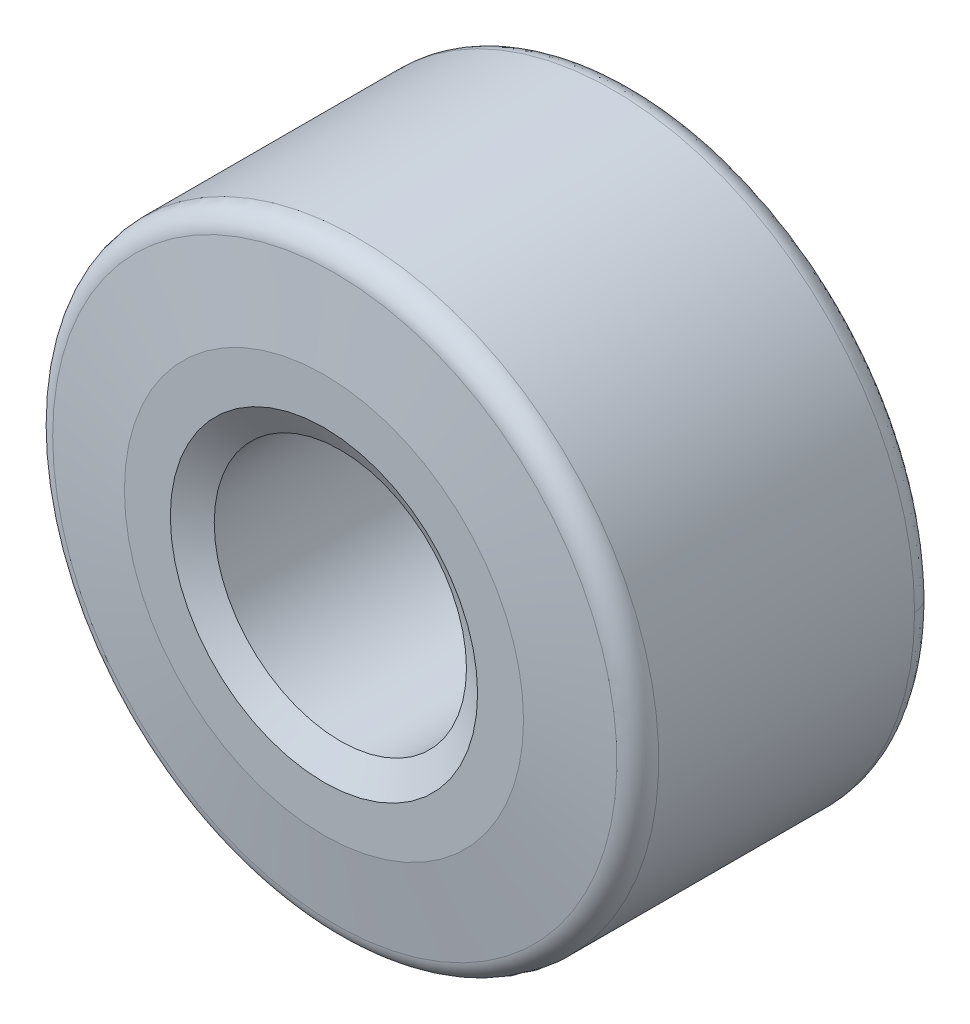
ISO-10303-21;
HEADER;
FILE_DESCRIPTION(('STEP AP214'),'2;1');
FILE_NAME('part.step','',(''),(''),'','','');
FILE_SCHEMA(('AUTOMOTIVE_DESIGN { 1 0 10303 214 1 1 1 1 }'));
ENDSEC;
DATA;
#1=APPLICATION_CONTEXT('core data for automotive mechanical design processes');
#2=APPLICATION_PROTOCOL_DEFINITION('international standard','automotive_design',2000,#1);
#3=PRODUCT_CONTEXT('',#1,'mechanical');
#4=PRODUCT('Part','Part','',(#3));
#5=PRODUCT_RELATED_PRODUCT_CATEGORY('part','',(#4));
#6=PRODUCT_DEFINITION_FORMATION('','',#4);
#7=PRODUCT_DEFINITION_CONTEXT('part definition',#1,'design');
#8=PRODUCT_DEFINITION('design','',#6,#7);
#9=PRODUCT_DEFINITION_SHAPE('','',#8);
#10=(LENGTH_UNIT() NAMED_UNIT(*) SI_UNIT(.MILLI.,.METRE.));
#11=(NAMED_UNIT(*) PLANE_ANGLE_UNIT() SI_UNIT($,.RADIAN.));
#12=(NAMED_UNIT(*) SI_UNIT($,.STERADIAN.) SOLID_ANGLE_UNIT());
#13=UNCERTAINTY_MEASURE_WITH_UNIT(LENGTH_MEASURE(1.E-05),#10,'distance_accuracy_value','');
#14=(GEOMETRIC_REPRESENTATION_CONTEXT(3) GLOBAL_UNCERTAINTY_ASSIGNED_CONTEXT((#13)) GLOBAL_UNIT_ASSIGNED_CONTEXT((#10,
#11,#12)) REPRESENTATION_CONTEXT('',''));
#15=CARTESIAN_POINT('',(0.,0.,0.));
#16=DIRECTION('',(0.,0.,1.));
#17=DIRECTION('',(1.,0.,0.));
#18=AXIS2_PLACEMENT_3D('',#15,#16,#17);
#19=CARTESIAN_POINT('',(117.,71.720826819,341.126186813));
#20=DIRECTION('',(0.,0.,1.));
#21=DIRECTION('',(1.,0.,0.));
#22=AXIS2_PLACEMENT_3D('',#19,#20,#21);
#23=CONICAL_SURFACE('',#22,28.07179677,1.03390574508139);
#24=CARTESIAN_POINT('',(117.,71.720826819,341.126186813));
#25=DIRECTION('',(0.,0.,-1.));
#26=DIRECTION('',(-1.,0.,0.));
#27=AXIS2_PLACEMENT_3D('',#24,#25,#26);
#28=CIRCLE('',#27,28.07179677);
#29=CARTESIAN_POINT('',(88.92820323,71.720826819,341.126186813));
#30=VERTEX_POINT('',#29);
#31=EDGE_CURVE('E92',#30,#30,#28,.F.);
#32=ORIENTED_EDGE('',*,*,#31,.F.);
#33=EDGE_LOOP('',(#32));
#34=FACE_BOUND('',#33,.T.);
#35=CARTESIAN_POINT('',(117.,71.720826819,344.77276519));
#36=DIRECTION('',(0.,0.,1.));
#37=DIRECTION('',(1.,0.,0.));
#38=AXIS2_PLACEMENT_3D('',#35,#36,#37);
#39=CIRCLE('',#38,34.1983294710001);
#40=CARTESIAN_POINT('',(151.198329471,71.720826819,344.77276519));
#41=VERTEX_POINT('',#40);
#42=EDGE_CURVE('E21',#41,#41,#39,.F.);
#43=ORIENTED_EDGE('',*,*,#42,.F.);
#44=EDGE_LOOP('',(#43));
#45=FACE_BOUND('',#44,.T.);
#46=ADVANCED_FACE('F17',(#34,#45),#23,.F.);
#47=CARTESIAN_POINT('',(117.,71.720826819,341.126186813));
#48=DIRECTION('',(0.,0.,-1.));
#49=DIRECTION('',(-1.,0.,0.));
#50=AXIS2_PLACEMENT_3D('',#47,#48,#49);
#51=CYLINDRICAL_SURFACE('',#50,28.07179677);
#52=CARTESIAN_POINT('',(117.,71.720826819,276.217998748));
#53=DIRECTION('',(0.,0.,-1.));
#54=DIRECTION('',(-1.,0.,0.));
#55=AXIS2_PLACEMENT_3D('',#52,#53,#54);
#56=CIRCLE('',#55,28.07179677);
#57=CARTESIAN_POINT('',(88.92820323,71.720826819,276.217998748));
#58=VERTEX_POINT('',#57);
#59=EDGE_CURVE('E88',#58,#58,#56,.F.);
#60=ORIENTED_EDGE('',*,*,#59,.F.);
#61=EDGE_LOOP('',(#60));
#62=FACE_BOUND('',#61,.T.);
#63=ORIENTED_EDGE('',*,*,#31,.T.);
#64=EDGE_LOOP('',(#63));
#65=FACE_BOUND('',#64,.T.);
#66=ADVANCED_FACE('F181',(#62,#65),#51,.F.);
#67=CARTESIAN_POINT('',(72.050336377,26.771163195,344.77276519));
#68=DIRECTION('',(0.,0.,1.));
#69=DIRECTION('',(1.,0.,0.));
#70=AXIS2_PLACEMENT_3D('',#67,#68,#69);
#71=PLANE('',#70);
#72=ORIENTED_EDGE('',*,*,#42,.T.);
#73=EDGE_LOOP('',(#72));
#74=FACE_BOUND('',#73,.T.);
#75=CARTESIAN_POINT('',(117.,71.720826819,344.77276519));
#76=DIRECTION('',(0.,0.,-1.));
#77=DIRECTION('',(0.,1.,0.));
#78=AXIS2_PLACEMENT_3D('',#75,#76,#77);
#79=CIRCLE('',#78,44.4166636589996);
#80=CARTESIAN_POINT('',(117.,116.137490478,344.77276519));
#81=VERTEX_POINT('',#80);
#82=EDGE_CURVE('E91',#81,#81,#79,.F.);
#83=ORIENTED_EDGE('',*,*,#82,.T.);
#84=EDGE_LOOP('',(#83));
#85=FACE_BOUND('',#84,.T.);
#86=ADVANCED_FACE('F101',(#74,#85),#71,.T.);
#87=CARTESIAN_POINT('',(117.,71.720826819,276.217998748));
#88=DIRECTION('',(0.,0.,-1.));
#89=DIRECTION('',(-1.,0.,0.));
#90=AXIS2_PLACEMENT_3D('',#87,#88,#89);
#91=CONICAL_SURFACE('',#90,28.07179677,1.05666839407383);
#92=CARTESIAN_POINT('',(117.,71.720826819,272.757789575));
#93=DIRECTION('',(0.,0.,-1.));
#94=DIRECTION('',(-1.,0.,0.));
#95=AXIS2_PLACEMENT_3D('',#92,#93,#94);
#96=CIRCLE('',#95,34.1983294710002);
#97=CARTESIAN_POINT('',(82.8016705289998,71.720826819,272.757789575));
#98=VERTEX_POINT('',#97);
#99=EDGE_CURVE('E87',#98,#98,#96,.F.);
#100=ORIENTED_EDGE('',*,*,#99,.F.);
#101=EDGE_LOOP('',(#100));
#102=FACE_BOUND('',#101,.T.);
#103=ORIENTED_EDGE('',*,*,#59,.T.);
#104=EDGE_LOOP('',(#103));
#105=FACE_BOUND('',#104,.T.);
#106=ADVANCED_FACE('F106',(#102,#105),#91,.F.);
#107=CARTESIAN_POINT('',(117.,71.720826819,344.77276519));
#108=DIRECTION('',(0.,0.,-1.));
#109=DIRECTION('',(0.,1.,0.));
#110=AXIS2_PLACEMENT_3D('',#107,#108,#109);
#111=CONICAL_SURFACE('',#110,44.416663659,1.44042206392276);
#112=CARTESIAN_POINT('',(117.,71.720826819,342.363235782068));
#113=DIRECTION('',(0.,0.,-1.));
#114=DIRECTION('',(-1.,0.,0.));
#115=AXIS2_PLACEMENT_3D('',#112,#113,#114);
#116=CIRCLE('',#115,62.7934652599709);
#117=CARTESIAN_POINT('',(54.2065347400291,71.720826819,342.363235782068));
#118=VERTEX_POINT('',#117);
#119=EDGE_CURVE('E81',#118,#118,#116,.T.);
#120=ORIENTED_EDGE('',*,*,#119,.F.);
#121=EDGE_LOOP('',(#120));
#122=FACE_BOUND('',#121,.T.);
#123=ORIENTED_EDGE('',*,*,#82,.F.);
#124=EDGE_LOOP('',(#123));
#125=FACE_BOUND('',#124,.T.);
#126=ADVANCED_FACE('F103',(#122,#125),#111,.T.);
#127=CARTESIAN_POINT('',(161.949663623,26.771163195,272.757789575));
#128=DIRECTION('',(0.,0.,-1.));
#129=DIRECTION('',(-1.,0.,0.));
#130=AXIS2_PLACEMENT_3D('',#127,#128,#129);
#131=PLANE('',#130);
#132=ORIENTED_EDGE('',*,*,#99,.T.);
#133=EDGE_LOOP('',(#132));
#134=FACE_BOUND('',#133,.T.);
#135=CARTESIAN_POINT('',(117.,71.720826819,272.757789575));
#136=DIRECTION('',(0.,0.,1.));
#137=DIRECTION('',(1.,0.,0.));
#138=AXIS2_PLACEMENT_3D('',#135,#136,#137);
#139=CIRCLE('',#138,44.4166636589994);
#140=CARTESIAN_POINT('',(161.416663658999,71.720826819,272.757789575));
#141=VERTEX_POINT('',#140);
#142=EDGE_CURVE('E64',#141,#141,#139,.F.);
#143=ORIENTED_EDGE('',*,*,#142,.T.);
#144=EDGE_LOOP('',(#143));
#145=FACE_BOUND('',#144,.T.);
#146=ADVANCED_FACE('F105',(#134,#145),#131,.T.);
#147=CARTESIAN_POINT('',(117.,71.720826819,337.405669247897));
#148=DIRECTION('',(0.,0.,1.));
#149=DIRECTION('',(1.,0.,0.));
#150=AXIS2_PLACEMENT_3D('',#147,#148,#149);
#151=TOROIDAL_SURFACE('',#150,62.1434390655971,4.9999999997442);
#152=ORIENTED_EDGE('',*,*,#119,.T.);
#153=EDGE_LOOP('',(#152));
#154=FACE_BOUND('',#153,.T.);
#155=CARTESIAN_POINT('',(117.,71.720826819,337.405669247));
#156=DIRECTION('',(0.,0.,-1.));
#157=DIRECTION('',(-1.,0.,0.));
#158=AXIS2_PLACEMENT_3D('',#155,#156,#157);
#159=CIRCLE('',#158,67.143439066);
#160=CARTESIAN_POINT('',(49.856560934,71.720826819,337.405669247));
#161=VERTEX_POINT('',#160);
#162=EDGE_CURVE('E56',#161,#161,#159,.F.);
#163=ORIENTED_EDGE('',*,*,#162,.T.);
#164=EDGE_LOOP('',(#163));
#165=FACE_BOUND('',#164,.T.);
#166=ADVANCED_FACE('F19',(#154,#165),#151,.T.);
#167=CARTESIAN_POINT('',(117.,71.720826819,272.757789575));
#168=DIRECTION('',(0.,0.,1.));
#169=DIRECTION('',(1.,0.,0.));
#170=AXIS2_PLACEMENT_3D('',#167,#168,#169);
#171=CONICAL_SURFACE('',#170,44.416663659,1.4229309625579);
#172=CARTESIAN_POINT('',(117.,71.720826819,275.507961254697));
#173=DIRECTION('',(0.,0.,1.));
#174=DIRECTION('',(1.,0.,0.));
#175=AXIS2_PLACEMENT_3D('',#172,#173,#174);
#176=CIRCLE('',#175,62.8800747072118);
#177=CARTESIAN_POINT('',(179.880074706411,71.7208268152358,275.507961254505));
#178=VERTEX_POINT('',#177);
#179=CARTESIAN_POINT('',(54.1199252951898,71.7208267932061,275.507961254121));
#180=VERTEX_POINT('',#179);
#181=EDGE_CURVE('E46',#178,#180,#176,.T.);
#182=ORIENTED_EDGE('',*,*,#181,.F.);
#183=CARTESIAN_POINT('',(117.,71.720826819,275.507961254697));
#184=DIRECTION('',(0.,0.,1.));
#185=DIRECTION('',(1.,0.,0.));
#186=AXIS2_PLACEMENT_3D('',#183,#184,#185);
#187=CIRCLE('',#186,62.8800747072118);
#188=EDGE_CURVE('E43',#180,#178,#187,.T.);
#189=ORIENTED_EDGE('',*,*,#188,.F.);
#190=EDGE_LOOP('',(#182,#189));
#191=FACE_BOUND('',#190,.T.);
#192=ORIENTED_EDGE('',*,*,#142,.F.);
#193=EDGE_LOOP('',(#192));
#194=FACE_BOUND('',#193,.T.);
#195=ADVANCED_FACE('F47',(#191,#194),#171,.T.);
#196=CARTESIAN_POINT('',(117.,71.720826819,337.405669247));
#197=DIRECTION('',(0.,0.,-1.));
#198=DIRECTION('',(0.,1.,0.));
#199=AXIS2_PLACEMENT_3D('',#196,#197,#198);
#200=CYLINDRICAL_SURFACE('',#199,67.143439066);
#201=CARTESIAN_POINT('',(117.,71.720826819,280.453400355102));
#202=DIRECTION('',(0.,0.,-1.));
#203=DIRECTION('',(0.,1.,0.));
#204=AXIS2_PLACEMENT_3D('',#201,#202,#203);
#205=CIRCLE('',#204,67.1434390657238);
#206=CARTESIAN_POINT('',(49.8565609341036,71.7208268129709,280.453400357538));
#207=VERTEX_POINT('',#206);
#208=CARTESIAN_POINT('',(184.143439065931,71.720826798343,280.453400358026));
#209=VERTEX_POINT('',#208);
#210=EDGE_CURVE('E27',#207,#209,#205,.T.);
#211=ORIENTED_EDGE('',*,*,#210,.F.);
#212=CARTESIAN_POINT('',(117.,71.720826819,280.453400355102));
#213=DIRECTION('',(0.,0.,-1.));
#214=DIRECTION('',(0.,1.,0.));
#215=AXIS2_PLACEMENT_3D('',#212,#213,#214);
#216=CIRCLE('',#215,67.1434390657238);
#217=EDGE_CURVE('E35',#209,#207,#216,.T.);
#218=ORIENTED_EDGE('',*,*,#217,.F.);
#219=EDGE_LOOP('',(#211,#218));
#220=FACE_BOUND('',#219,.T.);
#221=ORIENTED_EDGE('',*,*,#162,.F.);
#222=EDGE_LOOP('',(#221));
#223=FACE_BOUND('',#222,.T.);
#224=ADVANCED_FACE('F124',(#220,#223),#200,.T.);
#225=CARTESIAN_POINT('',(49.881540108,71.720826819,280.952567442));
#226=CARTESIAN_POINT('',(49.881540108,-62.516092966,280.952567442));
#227=CARTESIAN_POINT('',(184.118459892,-62.516092966,280.952567442));
#228=CARTESIAN_POINT('',(184.118459892,71.720826819,280.952567442));
#229=CARTESIAN_POINT('',(49.576900876,71.720826819,277.916336547));
#230=CARTESIAN_POINT('',(49.576900876,-63.125371429,277.916336547));
#231=CARTESIAN_POINT('',(184.423099124,-63.125371429,277.916336547));
#232=CARTESIAN_POINT('',(184.423099124,71.720826819,277.916336547));
#233=CARTESIAN_POINT('',(51.569344866,71.720826819,275.605131221));
#234=CARTESIAN_POINT('',(51.569344866,-59.140483449,275.605131221));
#235=CARTESIAN_POINT('',(182.430655134,-59.140483449,275.605131221));
#236=CARTESIAN_POINT('',(182.430655134,71.720826819,275.605131221));
#237=CARTESIAN_POINT('',(54.617325489,71.720826819,275.459126998));
#238=CARTESIAN_POINT('',(54.617325489,-53.044522203,275.459126998));
#239=CARTESIAN_POINT('',(179.382674511,-53.044522203,275.459126998));
#240=CARTESIAN_POINT('',(179.382674511,71.720826819,275.459126998));
#241=(BOUNDED_SURFACE() B_SPLINE_SURFACE(3,3,((#225,#226,#227,#228),(#229,#230,#231,#232),(#233,
#234,#235,#236),(#237,#238,#239,#240)),.UNSPECIFIED.,.F.,.F.,
.F.) B_SPLINE_SURFACE_WITH_KNOTS((4,4),(4,4),(0.,1.),(0.,1.),
.UNSPECIFIED.) GEOMETRIC_REPRESENTATION_ITEM() RATIONAL_B_SPLINE_SURFACE(((1.,0.333333333333333,
0.333333333333333,1.),(0.792290842430709,0.264096947476903,0.264096947476903,0.792290842430709),
(0.792290842430709,0.264096947476903,0.264096947476903,0.792290842430709),(1.,0.333333333333333,
0.333333333333333,1.))) REPRESENTATION_ITEM('') SURFACE());
#242=CARTESIAN_POINT('',(184.118459892,71.720826819,280.952567442));
#243=CARTESIAN_POINT('',(184.423099124,71.720826819,277.916336547));
#244=CARTESIAN_POINT('',(182.430655134,71.720826819,275.605131221));
#245=CARTESIAN_POINT('',(179.382674511,71.720826819,275.459126998));
#246=(BOUNDED_CURVE() B_SPLINE_CURVE(3,(#242,#243,#244,#245),.UNSPECIFIED.,.F.,
.F.) B_SPLINE_CURVE_WITH_KNOTS((4,4),(0.,1.),
.UNSPECIFIED.) CURVE() GEOMETRIC_REPRESENTATION_ITEM() RATIONAL_B_SPLINE_CURVE((1.,
0.792290842430708,0.792290842430708,1.)) REPRESENTATION_ITEM(''));
#247=EDGE_CURVE('E11',#209,#178,#246,.T.);
#248=CARTESIAN_POINT('',(49.881540108,71.720826819,280.952567442));
#249=CARTESIAN_POINT('',(49.576900876,71.720826819,277.916336547));
#250=CARTESIAN_POINT('',(51.569344866,71.720826819,275.605131221));
#251=CARTESIAN_POINT('',(54.617325489,71.720826819,275.459126998));
#252=(BOUNDED_CURVE() B_SPLINE_CURVE(3,(#248,#249,#250,#251),.UNSPECIFIED.,.F.,
.F.) B_SPLINE_CURVE_WITH_KNOTS((4,4),(0.,1.),
.UNSPECIFIED.) CURVE() GEOMETRIC_REPRESENTATION_ITEM() RATIONAL_B_SPLINE_CURVE((1.,
0.792290842430708,0.792290842430708,1.)) REPRESENTATION_ITEM(''));
#253=EDGE_CURVE('E51',#180,#207,#252,.F.);
#254=ORIENTED_EDGE('',*,*,#247,.F.);
#255=ORIENTED_EDGE('',*,*,#217,.T.);
#256=ORIENTED_EDGE('',*,*,#253,.F.);
#257=ORIENTED_EDGE('',*,*,#188,.T.);
#258=EDGE_LOOP('',(#254,#255,#256,#257));
#259=FACE_BOUND('',#258,.T.);
#260=ADVANCED_FACE('F54',(#259),#241,.T.);
#261=CARTESIAN_POINT('',(184.118459892,71.720826819,280.952567442));
#262=CARTESIAN_POINT('',(184.118459892,205.957746603,280.952567442));
#263=CARTESIAN_POINT('',(49.881540108,205.957746603,280.952567442));
#264=CARTESIAN_POINT('',(49.881540108,71.720826819,280.952567442));
#265=CARTESIAN_POINT('',(184.423099124,71.720826819,277.916336547));
#266=CARTESIAN_POINT('',(184.423099124,206.567025066,277.916336547));
#267=CARTESIAN_POINT('',(49.576900876,206.567025066,277.916336547));
#268=CARTESIAN_POINT('',(49.576900876,71.720826819,277.916336547));
#269=CARTESIAN_POINT('',(182.430655134,71.720826819,275.605131221));
#270=CARTESIAN_POINT('',(182.430655134,202.582137086,275.605131221));
#271=CARTESIAN_POINT('',(51.569344866,202.582137086,275.605131221));
#272=CARTESIAN_POINT('',(51.569344866,71.720826819,275.605131221));
#273=CARTESIAN_POINT('',(179.382674511,71.720826819,275.459126998));
#274=CARTESIAN_POINT('',(179.382674511,196.486175841,275.459126998));
#275=CARTESIAN_POINT('',(54.617325489,196.486175841,275.459126998));
#276=CARTESIAN_POINT('',(54.617325489,71.720826819,275.459126998));
#277=(BOUNDED_SURFACE() B_SPLINE_SURFACE(3,3,((#261,#262,#263,#264),(#265,#266,#267,#268),(#269,
#270,#271,#272),(#273,#274,#275,#276)),.UNSPECIFIED.,.F.,.F.,
.F.) B_SPLINE_SURFACE_WITH_KNOTS((4,4),(4,4),(0.,1.),(0.,1.),
.UNSPECIFIED.) GEOMETRIC_REPRESENTATION_ITEM() RATIONAL_B_SPLINE_SURFACE(((1.,0.333333333333333,
0.333333333333333,1.),(0.792290842430708,0.264096947476903,0.264096947476903,0.792290842430708),
(0.792290842430708,0.264096947476903,0.264096947476903,0.792290842430708),(1.,0.333333333333333,
0.333333333333333,1.))) REPRESENTATION_ITEM('') SURFACE());
#278=ORIENTED_EDGE('',*,*,#210,.T.);
#279=ORIENTED_EDGE('',*,*,#247,.T.);
#280=ORIENTED_EDGE('',*,*,#181,.T.);
#281=ORIENTED_EDGE('',*,*,#253,.T.);
#282=EDGE_LOOP('',(#278,#279,#280,#281));
#283=FACE_BOUND('',#282,.T.);
#284=ADVANCED_FACE('F58',(#283),#277,.T.);
#285=CLOSED_SHELL('',(#46,#66,#86,#106,#126,#146,#166,#195,#224,#260,#284));
#286=MANIFOLD_SOLID_BREP('B1',#285);
#287=ADVANCED_BREP_SHAPE_REPRESENTATION('',(#18,#286),#14);
#288=SHAPE_DEFINITION_REPRESENTATION(#9,#287);
ENDSEC;
END-ISO-10303-21;
